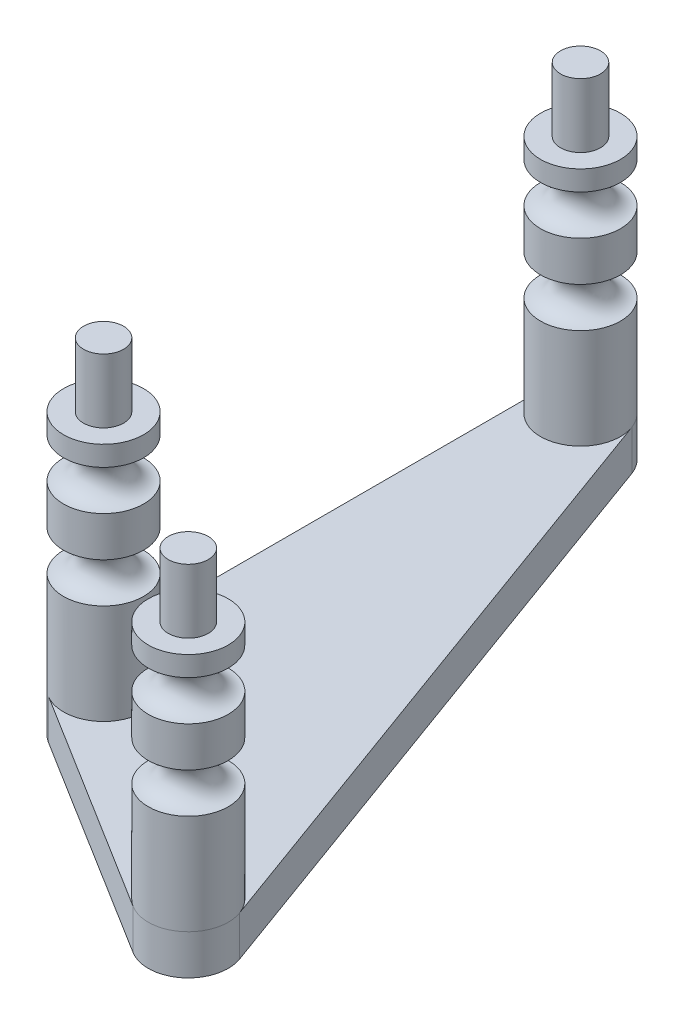
ISO-10303-21;
HEADER;
FILE_DESCRIPTION(('STEP AP214'),'2;1');
FILE_NAME('part.step','',(''),(''),'','','');
FILE_SCHEMA(('AUTOMOTIVE_DESIGN { 1 0 10303 214 1 1 1 1 }'));
ENDSEC;
DATA;
#1=APPLICATION_CONTEXT('core data for automotive mechanical design processes');
#2=APPLICATION_PROTOCOL_DEFINITION('international standard','automotive_design',2000,#1);
#3=PRODUCT_CONTEXT('',#1,'mechanical');
#4=PRODUCT('Part','Part','',(#3));
#5=PRODUCT_RELATED_PRODUCT_CATEGORY('part','',(#4));
#6=PRODUCT_DEFINITION_FORMATION('','',#4);
#7=PRODUCT_DEFINITION_CONTEXT('part definition',#1,'design');
#8=PRODUCT_DEFINITION('design','',#6,#7);
#9=PRODUCT_DEFINITION_SHAPE('','',#8);
#10=(LENGTH_UNIT() NAMED_UNIT(*) SI_UNIT(.MILLI.,.METRE.));
#11=(NAMED_UNIT(*) PLANE_ANGLE_UNIT() SI_UNIT($,.RADIAN.));
#12=(NAMED_UNIT(*) SI_UNIT($,.STERADIAN.) SOLID_ANGLE_UNIT());
#13=UNCERTAINTY_MEASURE_WITH_UNIT(LENGTH_MEASURE(1.E-05),#10,'distance_accuracy_value','');
#14=(GEOMETRIC_REPRESENTATION_CONTEXT(3) GLOBAL_UNCERTAINTY_ASSIGNED_CONTEXT((#13)) GLOBAL_UNIT_ASSIGNED_CONTEXT((#10,
#11,#12)) REPRESENTATION_CONTEXT('',''));
#15=CARTESIAN_POINT('',(0.,0.,0.));
#16=DIRECTION('',(0.,0.,1.));
#17=DIRECTION('',(1.,0.,0.));
#18=AXIS2_PLACEMENT_3D('',#15,#16,#17);
#19=CARTESIAN_POINT('',(0.,44.45,-75.68438));
#20=DIRECTION('',(0.,-1.,0.));
#21=DIRECTION('',(0.,0.,-1.));
#22=AXIS2_PLACEMENT_3D('',#19,#20,#21);
#23=CYLINDRICAL_SURFACE('',#22,6.35);
#24=CARTESIAN_POINT('',(0.,6.35,-75.68438));
#25=DIRECTION('',(0.,1.,0.));
#26=DIRECTION('',(0.,0.,1.));
#27=AXIS2_PLACEMENT_3D('',#24,#25,#26);
#28=CIRCLE('',#27,6.35);
#29=CARTESIAN_POINT('',(-6.35,6.35,-75.68438));
#30=VERTEX_POINT('',#29);
#31=CARTESIAN_POINT('',(5.96704814199053,6.35,-77.856207910118));
#32=VERTEX_POINT('',#31);
#33=EDGE_CURVE('E343',#30,#32,#28,.F.);
#34=ORIENTED_EDGE('',*,*,#33,.F.);
#35=EDGE_CURVE('E346',#32,#30,#28,.F.);
#36=ORIENTED_EDGE('',*,*,#35,.F.);
#37=EDGE_LOOP('',(#34,#36));
#38=FACE_BOUND('',#37,.T.);
#39=CARTESIAN_POINT('',(0.,22.225,-75.68438));
#40=DIRECTION('',(0.,1.,0.));
#41=DIRECTION('',(0.,0.,1.));
#42=AXIS2_PLACEMENT_3D('',#39,#40,#41);
#43=CIRCLE('',#42,6.35);
#44=CARTESIAN_POINT('',(0.,22.225,-69.33438));
#45=VERTEX_POINT('',#44);
#46=EDGE_CURVE('E301',#45,#45,#43,.T.);
#47=ORIENTED_EDGE('',*,*,#46,.F.);
#48=EDGE_LOOP('',(#47));
#49=FACE_BOUND('',#48,.T.);
#50=ADVANCED_FACE('F179',(#38,#49),#23,.T.);
#51=CARTESIAN_POINT('',(0.,6.35,0.));
#52=DIRECTION('',(0.,-1.,0.));
#53=DIRECTION('',(0.,0.,-1.));
#54=AXIS2_PLACEMENT_3D('',#51,#52,#53);
#55=CYLINDRICAL_SURFACE('',#54,6.35);
#56=DIRECTION('',(0.,-1.,0.));
#57=VECTOR('',#56,1.);
#58=CARTESIAN_POINT('',(-3.35600824597808,6.35,5.39070576575342));
#59=LINE('',#58,#57);
#60=CARTESIAN_POINT('',(-3.35600824597808,6.35,5.39070576575342));
#61=VERTEX_POINT('',#60);
#62=CARTESIAN_POINT('',(-3.35600824597808,0.,5.39070576575342));
#63=VERTEX_POINT('',#62);
#64=EDGE_CURVE('E477',#61,#63,#59,.T.);
#65=ORIENTED_EDGE('',*,*,#64,.F.);
#66=CARTESIAN_POINT('',(0.,6.35,0.));
#67=DIRECTION('',(0.,1.,0.));
#68=DIRECTION('',(0.,0.,1.));
#69=AXIS2_PLACEMENT_3D('',#66,#67,#68);
#70=CIRCLE('',#69,6.35);
#71=CARTESIAN_POINT('',(-6.35,6.35,0.));
#72=VERTEX_POINT('',#71);
#73=EDGE_CURVE('E468',#72,#61,#70,.F.);
#74=ORIENTED_EDGE('',*,*,#73,.F.);
#75=DIRECTION('',(0.,-1.,0.));
#76=VECTOR('',#75,1.);
#77=CARTESIAN_POINT('',(-6.35,6.35,0.));
#78=LINE('',#77,#76);
#79=CARTESIAN_POINT('',(-6.35,0.,0.));
#80=VERTEX_POINT('',#79);
#81=EDGE_CURVE('E358',#72,#80,#78,.T.);
#82=ORIENTED_EDGE('',*,*,#81,.T.);
#83=CARTESIAN_POINT('',(0.,0.,0.));
#84=DIRECTION('',(0.,1.,0.));
#85=DIRECTION('',(0.,0.,1.));
#86=AXIS2_PLACEMENT_3D('',#83,#84,#85);
#87=CIRCLE('',#86,6.35);
#88=EDGE_CURVE('E347',#80,#63,#87,.T.);
#89=ORIENTED_EDGE('',*,*,#88,.T.);
#90=EDGE_LOOP('',(#65,#74,#82,#89));
#91=FACE_BOUND('',#90,.T.);
#92=CARTESIAN_POINT('',(0.,22.225,0.));
#93=DIRECTION('',(0.,1.,0.));
#94=DIRECTION('',(0.,0.,1.));
#95=AXIS2_PLACEMENT_3D('',#92,#93,#94);
#96=CIRCLE('',#95,6.35);
#97=CARTESIAN_POINT('',(0.,22.225,6.35));
#98=VERTEX_POINT('',#97);
#99=EDGE_CURVE('E287',#98,#98,#96,.T.);
#100=ORIENTED_EDGE('',*,*,#99,.F.);
#101=EDGE_LOOP('',(#100));
#102=FACE_BOUND('',#101,.T.);
#103=ADVANCED_FACE('F334',(#91,#102),#55,.T.);
#104=CARTESIAN_POINT('',(35.617471135486,44.45,22.1738176828264));
#105=DIRECTION('',(0.,-1.,0.));
#106=DIRECTION('',(0.,0.,-1.));
#107=AXIS2_PLACEMENT_3D('',#104,#105,#106);
#108=CYLINDRICAL_SURFACE('',#107,6.35);
#109=CARTESIAN_POINT('',(35.617471135486,6.35,22.1738176828264));
#110=DIRECTION('',(0.,1.,0.));
#111=DIRECTION('',(0.,0.,1.));
#112=AXIS2_PLACEMENT_3D('',#109,#110,#111);
#113=CIRCLE('',#112,6.35);
#114=CARTESIAN_POINT('',(32.2614628895079,6.35,27.5645234485798));
#115=VERTEX_POINT('',#114);
#116=CARTESIAN_POINT('',(41.5845192774765,6.35,20.0019897727084));
#117=VERTEX_POINT('',#116);
#118=EDGE_CURVE('E239',#115,#117,#113,.F.);
#119=ORIENTED_EDGE('',*,*,#118,.F.);
#120=EDGE_CURVE('E235',#117,#115,#113,.F.);
#121=ORIENTED_EDGE('',*,*,#120,.F.);
#122=EDGE_LOOP('',(#119,#121));
#123=FACE_BOUND('',#122,.T.);
#124=CARTESIAN_POINT('',(35.617471135486,22.225,22.1738176828264));
#125=DIRECTION('',(0.,1.,0.));
#126=DIRECTION('',(0.,0.,1.));
#127=AXIS2_PLACEMENT_3D('',#124,#125,#126);
#128=CIRCLE('',#127,6.35);
#129=CARTESIAN_POINT('',(35.617471135486,22.225,28.5238176828264));
#130=VERTEX_POINT('',#129);
#131=EDGE_CURVE('E276',#130,#130,#128,.T.);
#132=ORIENTED_EDGE('',*,*,#131,.F.);
#133=EDGE_LOOP('',(#132));
#134=FACE_BOUND('',#133,.T.);
#135=ADVANCED_FACE('F237',(#123,#134),#108,.T.);
#136=CARTESIAN_POINT('',(0.,6.35,0.));
#137=DIRECTION('',(0.,1.,0.));
#138=DIRECTION('',(0.,0.,1.));
#139=AXIS2_PLACEMENT_3D('',#136,#137,#138);
#140=PLANE('',#139);
#141=DIRECTION('',(-0.848930041850932,0.,-0.528505235587099));
#142=VECTOR('',#141,1.);
#143=CARTESIAN_POINT('',(-3.35600824597808,6.35,5.39070576575342));
#144=LINE('',#143,#142);
#145=EDGE_CURVE('E253',#115,#61,#144,.T.);
#146=ORIENTED_EDGE('',*,*,#145,.F.);
#147=ORIENTED_EDGE('',*,*,#118,.T.);
#148=DIRECTION('',(0.342020143325663,0.,0.939692620785911));
#149=VECTOR('',#148,1.);
#150=CARTESIAN_POINT('',(30.291538997394,6.35,-11.0252185451651));
#151=LINE('',#150,#149);
#152=EDGE_CURVE('E244',#32,#117,#151,.T.);
#153=ORIENTED_EDGE('',*,*,#152,.F.);
#154=ORIENTED_EDGE('',*,*,#35,.T.);
#155=DIRECTION('',(0.,0.,-1.));
#156=VECTOR('',#155,1.);
#157=CARTESIAN_POINT('',(-6.35,6.35,0.));
#158=LINE('',#157,#156);
#159=EDGE_CURVE('E351',#72,#30,#158,.T.);
#160=ORIENTED_EDGE('',*,*,#159,.F.);
#161=ORIENTED_EDGE('',*,*,#73,.T.);
#162=EDGE_LOOP('',(#146,#147,#153,#154,#160,#161));
#163=FACE_BOUND('',#162,.T.);
#164=ADVANCED_FACE('F249',(#163),#140,.T.);
#165=CARTESIAN_POINT('',(-3.35600824597808,6.35,5.39070576575342));
#166=DIRECTION('',(-0.528505235587099,0.,0.848930041850932));
#167=DIRECTION('',(0.848930041850932,0.,0.528505235587099));
#168=AXIS2_PLACEMENT_3D('',#165,#166,#167);
#169=PLANE('',#168);
#170=DIRECTION('',(-0.848930041850932,0.,-0.528505235587099));
#171=VECTOR('',#170,1.);
#172=CARTESIAN_POINT('',(-3.35600824597808,0.,5.39070576575342));
#173=LINE('',#172,#171);
#174=CARTESIAN_POINT('',(32.2614628895079,0.,27.5645234485798));
#175=VERTEX_POINT('',#174);
#176=EDGE_CURVE('E359',#175,#63,#173,.T.);
#177=ORIENTED_EDGE('',*,*,#176,.F.);
#178=DIRECTION('',(0.,-1.,0.));
#179=VECTOR('',#178,1.);
#180=CARTESIAN_POINT('',(32.2614628895079,6.35,27.5645234485798));
#181=LINE('',#180,#179);
#182=EDGE_CURVE('E268',#175,#115,#181,.F.);
#183=ORIENTED_EDGE('',*,*,#182,.T.);
#184=ORIENTED_EDGE('',*,*,#145,.T.);
#185=ORIENTED_EDGE('',*,*,#64,.T.);
#186=EDGE_LOOP('',(#177,#183,#184,#185));
#187=FACE_BOUND('',#186,.T.);
#188=ADVANCED_FACE('F380',(#187),#169,.T.);
#189=CARTESIAN_POINT('',(30.291538997394,6.35,-11.0252185451651));
#190=DIRECTION('',(0.93969262078591,0.,-0.342020143325663));
#191=DIRECTION('',(-0.342020143325663,0.,-0.939692620785911));
#192=AXIS2_PLACEMENT_3D('',#189,#190,#191);
#193=PLANE('',#192);
#194=ORIENTED_EDGE('',*,*,#152,.T.);
#195=DIRECTION('',(0.,-1.,0.));
#196=VECTOR('',#195,1.);
#197=CARTESIAN_POINT('',(41.5845192774765,6.35,20.0019897727084));
#198=LINE('',#197,#196);
#199=CARTESIAN_POINT('',(41.5845192774765,0.,20.0019897727084));
#200=VERTEX_POINT('',#199);
#201=EDGE_CURVE('E259',#117,#200,#198,.T.);
#202=ORIENTED_EDGE('',*,*,#201,.T.);
#203=DIRECTION('',(0.342020143325663,0.,0.939692620785911));
#204=VECTOR('',#203,1.);
#205=CARTESIAN_POINT('',(30.291538997394,0.,-11.0252185451651));
#206=LINE('',#205,#204);
#207=CARTESIAN_POINT('',(5.96704814199053,0.,-77.856207910118));
#208=VERTEX_POINT('',#207);
#209=EDGE_CURVE('E472',#208,#200,#206,.T.);
#210=ORIENTED_EDGE('',*,*,#209,.F.);
#211=DIRECTION('',(0.,-1.,0.));
#212=VECTOR('',#211,1.);
#213=CARTESIAN_POINT('',(5.96704814199053,6.35,-77.856207910118));
#214=LINE('',#213,#212);
#215=EDGE_CURVE('E254',#208,#32,#214,.F.);
#216=ORIENTED_EDGE('',*,*,#215,.T.);
#217=EDGE_LOOP('',(#194,#202,#210,#216));
#218=FACE_BOUND('',#217,.T.);
#219=ADVANCED_FACE('F257',(#218),#193,.T.);
#220=CARTESIAN_POINT('',(0.,0.,0.));
#221=DIRECTION('',(0.,1.,0.));
#222=DIRECTION('',(0.,0.,1.));
#223=AXIS2_PLACEMENT_3D('',#220,#221,#222);
#224=PLANE('',#223);
#225=ORIENTED_EDGE('',*,*,#209,.T.);
#226=CARTESIAN_POINT('',(35.617471135486,0.,22.1738176828264));
#227=DIRECTION('',(0.,1.,0.));
#228=DIRECTION('',(0.,0.,1.));
#229=AXIS2_PLACEMENT_3D('',#226,#227,#228);
#230=CIRCLE('',#229,6.35);
#231=EDGE_CURVE('E204',#200,#175,#230,.F.);
#232=ORIENTED_EDGE('',*,*,#231,.T.);
#233=ORIENTED_EDGE('',*,*,#176,.T.);
#234=ORIENTED_EDGE('',*,*,#88,.F.);
#235=DIRECTION('',(0.,0.,-1.));
#236=VECTOR('',#235,1.);
#237=CARTESIAN_POINT('',(-6.35,0.,0.));
#238=LINE('',#237,#236);
#239=CARTESIAN_POINT('',(-6.35,0.,-75.68438));
#240=VERTEX_POINT('',#239);
#241=EDGE_CURVE('E360',#80,#240,#238,.T.);
#242=ORIENTED_EDGE('',*,*,#241,.T.);
#243=CARTESIAN_POINT('',(0.,0.,-75.68438));
#244=DIRECTION('',(0.,1.,0.));
#245=DIRECTION('',(0.,0.,1.));
#246=AXIS2_PLACEMENT_3D('',#243,#244,#245);
#247=CIRCLE('',#246,6.35);
#248=EDGE_CURVE('E196',#240,#208,#247,.F.);
#249=ORIENTED_EDGE('',*,*,#248,.T.);
#250=EDGE_LOOP('',(#225,#232,#233,#234,#242,#249));
#251=FACE_BOUND('',#250,.T.);
#252=ADVANCED_FACE('F374',(#251),#224,.F.);
#253=CARTESIAN_POINT('',(-6.35,6.35,0.));
#254=DIRECTION('',(-1.,0.,0.));
#255=DIRECTION('',(0.,0.,1.));
#256=AXIS2_PLACEMENT_3D('',#253,#254,#255);
#257=PLANE('',#256);
#258=ORIENTED_EDGE('',*,*,#159,.T.);
#259=DIRECTION('',(0.,-1.,0.));
#260=VECTOR('',#259,1.);
#261=CARTESIAN_POINT('',(-6.35,6.35,-75.68438));
#262=LINE('',#261,#260);
#263=EDGE_CURVE('E270',#30,#240,#262,.T.);
#264=ORIENTED_EDGE('',*,*,#263,.T.);
#265=ORIENTED_EDGE('',*,*,#241,.F.);
#266=ORIENTED_EDGE('',*,*,#81,.F.);
#267=EDGE_LOOP('',(#258,#264,#265,#266));
#268=FACE_BOUND('',#267,.T.);
#269=ADVANCED_FACE('F355',(#268),#257,.T.);
#270=CARTESIAN_POINT('',(35.617471135486,6.35,22.1738176828264));
#271=DIRECTION('',(0.,-1.,0.));
#272=DIRECTION('',(0.,0.,-1.));
#273=AXIS2_PLACEMENT_3D('',#270,#271,#272);
#274=CYLINDRICAL_SURFACE('',#273,6.35);
#275=ORIENTED_EDGE('',*,*,#120,.T.);
#276=ORIENTED_EDGE('',*,*,#182,.F.);
#277=ORIENTED_EDGE('',*,*,#231,.F.);
#278=ORIENTED_EDGE('',*,*,#201,.F.);
#279=EDGE_LOOP('',(#275,#276,#277,#278));
#280=FACE_BOUND('',#279,.T.);
#281=ADVANCED_FACE('F262',(#280),#274,.T.);
#282=CARTESIAN_POINT('',(0.,6.35,-75.68438));
#283=DIRECTION('',(0.,-1.,0.));
#284=DIRECTION('',(0.,0.,-1.));
#285=AXIS2_PLACEMENT_3D('',#282,#283,#284);
#286=CYLINDRICAL_SURFACE('',#285,6.35);
#287=ORIENTED_EDGE('',*,*,#33,.T.);
#288=ORIENTED_EDGE('',*,*,#215,.F.);
#289=ORIENTED_EDGE('',*,*,#248,.F.);
#290=ORIENTED_EDGE('',*,*,#263,.F.);
#291=EDGE_LOOP('',(#287,#288,#289,#290));
#292=FACE_BOUND('',#291,.T.);
#293=ADVANCED_FACE('F181',(#292),#286,.T.);
#294=CARTESIAN_POINT('',(35.617471135486,25.4,22.1738176828264));
#295=DIRECTION('',(0.,-1.,0.));
#296=DIRECTION('',(0.,0.,-1.));
#297=AXIS2_PLACEMENT_3D('',#294,#295,#296);
#298=TOROIDAL_SURFACE('',#297,6.35,3.175);
#299=CARTESIAN_POINT('',(35.617471135486,28.575,22.1738176828264));
#300=DIRECTION('',(0.,-1.,0.));
#301=DIRECTION('',(0.,0.,-1.));
#302=AXIS2_PLACEMENT_3D('',#299,#300,#301);
#303=CIRCLE('',#302,6.35);
#304=CARTESIAN_POINT('',(35.617471135486,28.575,15.8238176828264));
#305=VERTEX_POINT('',#304);
#306=EDGE_CURVE('E273',#305,#305,#303,.T.);
#307=ORIENTED_EDGE('',*,*,#306,.T.);
#308=EDGE_LOOP('',(#307));
#309=FACE_BOUND('',#308,.T.);
#310=ORIENTED_EDGE('',*,*,#131,.T.);
#311=EDGE_LOOP('',(#310));
#312=FACE_BOUND('',#311,.T.);
#313=ADVANCED_FACE('F363',(#309,#312),#298,.F.);
#314=ORIENTED_EDGE('',*,*,#306,.F.);
#315=EDGE_LOOP('',(#314));
#316=FACE_BOUND('',#315,.T.);
#317=CARTESIAN_POINT('',(35.617471135486,34.925,22.1738176828264));
#318=DIRECTION('',(0.,1.,0.));
#319=DIRECTION('',(0.,0.,1.));
#320=AXIS2_PLACEMENT_3D('',#317,#318,#319);
#321=CIRCLE('',#320,6.35);
#322=CARTESIAN_POINT('',(35.617471135486,34.925,28.5238176828264));
#323=VERTEX_POINT('',#322);
#324=EDGE_CURVE('E283',#323,#323,#321,.T.);
#325=ORIENTED_EDGE('',*,*,#324,.F.);
#326=EDGE_LOOP('',(#325));
#327=FACE_BOUND('',#326,.T.);
#328=ADVANCED_FACE('F368',(#316,#327),#108,.T.);
#329=CARTESIAN_POINT('',(35.617471135486,38.1,22.1738176828264));
#330=DIRECTION('',(0.,-1.,0.));
#331=DIRECTION('',(0.,0.,-1.));
#332=AXIS2_PLACEMENT_3D('',#329,#330,#331);
#333=TOROIDAL_SURFACE('',#332,6.35,3.175);
#334=CARTESIAN_POINT('',(35.617471135486,41.275,22.1738176828264));
#335=DIRECTION('',(0.,-1.,0.));
#336=DIRECTION('',(0.,0.,-1.));
#337=AXIS2_PLACEMENT_3D('',#334,#335,#336);
#338=CIRCLE('',#337,6.35);
#339=CARTESIAN_POINT('',(35.617471135486,41.275,15.8238176828264));
#340=VERTEX_POINT('',#339);
#341=EDGE_CURVE('E280',#340,#340,#338,.T.);
#342=ORIENTED_EDGE('',*,*,#341,.T.);
#343=EDGE_LOOP('',(#342));
#344=FACE_BOUND('',#343,.T.);
#345=ORIENTED_EDGE('',*,*,#324,.T.);
#346=EDGE_LOOP('',(#345));
#347=FACE_BOUND('',#346,.T.);
#348=ADVANCED_FACE('F398',(#344,#347),#333,.F.);
#349=CARTESIAN_POINT('',(35.617471135486,54.61,22.1738176828264));
#350=DIRECTION('',(0.,1.,0.));
#351=DIRECTION('',(0.,0.,1.));
#352=AXIS2_PLACEMENT_3D('',#349,#350,#351);
#353=PLANE('',#352);
#354=CARTESIAN_POINT('',(35.617471135486,54.61,22.1738176828264));
#355=DIRECTION('',(0.,1.,0.));
#356=DIRECTION('',(0.,0.,1.));
#357=AXIS2_PLACEMENT_3D('',#354,#355,#356);
#358=CIRCLE('',#357,3.175);
#359=CARTESIAN_POINT('',(35.617471135486,54.61,25.3488176828264));
#360=VERTEX_POINT('',#359);
#361=EDGE_CURVE('E696',#360,#360,#358,.T.);
#362=ORIENTED_EDGE('',*,*,#361,.T.);
#363=EDGE_LOOP('',(#362));
#364=FACE_BOUND('',#363,.T.);
#365=ADVANCED_FACE('F420',(#364),#353,.T.);
#366=CARTESIAN_POINT('',(35.617471135486,54.61,22.1738176828264));
#367=DIRECTION('',(0.,-1.,0.));
#368=DIRECTION('',(0.,0.,-1.));
#369=AXIS2_PLACEMENT_3D('',#366,#367,#368);
#370=CYLINDRICAL_SURFACE('',#369,3.175);
#371=ORIENTED_EDGE('',*,*,#361,.F.);
#372=EDGE_LOOP('',(#371));
#373=FACE_BOUND('',#372,.T.);
#374=CARTESIAN_POINT('',(35.617471135486,44.45,22.1738176828264));
#375=DIRECTION('',(0.,1.,0.));
#376=DIRECTION('',(0.,0.,1.));
#377=AXIS2_PLACEMENT_3D('',#374,#375,#376);
#378=CIRCLE('',#377,3.175);
#379=CARTESIAN_POINT('',(35.617471135486,44.45,25.3488176828264));
#380=VERTEX_POINT('',#379);
#381=EDGE_CURVE('E188',#380,#380,#378,.T.);
#382=ORIENTED_EDGE('',*,*,#381,.T.);
#383=EDGE_LOOP('',(#382));
#384=FACE_BOUND('',#383,.T.);
#385=ADVANCED_FACE('F410',(#373,#384),#370,.T.);
#386=CARTESIAN_POINT('',(35.617471135486,44.45,22.1738176828264));
#387=DIRECTION('',(0.,1.,0.));
#388=DIRECTION('',(0.,0.,1.));
#389=AXIS2_PLACEMENT_3D('',#386,#387,#388);
#390=PLANE('',#389);
#391=ORIENTED_EDGE('',*,*,#381,.F.);
#392=EDGE_LOOP('',(#391));
#393=FACE_BOUND('',#392,.T.);
#394=CARTESIAN_POINT('',(35.617471135486,44.45,22.1738176828264));
#395=DIRECTION('',(0.,1.,0.));
#396=DIRECTION('',(0.,0.,1.));
#397=AXIS2_PLACEMENT_3D('',#394,#395,#396);
#398=CIRCLE('',#397,6.35);
#399=CARTESIAN_POINT('',(35.617471135486,44.45,28.5238176828264));
#400=VERTEX_POINT('',#399);
#401=EDGE_CURVE('E415',#400,#400,#398,.T.);
#402=ORIENTED_EDGE('',*,*,#401,.T.);
#403=EDGE_LOOP('',(#402));
#404=FACE_BOUND('',#403,.T.);
#405=ADVANCED_FACE('F402',(#393,#404),#390,.T.);
#406=ORIENTED_EDGE('',*,*,#401,.F.);
#407=EDGE_LOOP('',(#406));
#408=FACE_BOUND('',#407,.T.);
#409=ORIENTED_EDGE('',*,*,#341,.F.);
#410=EDGE_LOOP('',(#409));
#411=FACE_BOUND('',#410,.T.);
#412=ADVANCED_FACE('F392',(#408,#411),#108,.T.);
#413=CARTESIAN_POINT('',(0.,25.4,0.));
#414=DIRECTION('',(0.,1.,0.));
#415=DIRECTION('',(0.,0.,1.));
#416=AXIS2_PLACEMENT_3D('',#413,#414,#415);
#417=TOROIDAL_SURFACE('',#416,6.35,3.175);
#418=ORIENTED_EDGE('',*,*,#99,.T.);
#419=EDGE_LOOP('',(#418));
#420=FACE_BOUND('',#419,.T.);
#421=CARTESIAN_POINT('',(0.,28.575,0.));
#422=DIRECTION('',(0.,-1.,0.));
#423=DIRECTION('',(0.,0.,-1.));
#424=AXIS2_PLACEMENT_3D('',#421,#422,#423);
#425=CIRCLE('',#424,6.35);
#426=CARTESIAN_POINT('',(0.,28.575,-6.35));
#427=VERTEX_POINT('',#426);
#428=EDGE_CURVE('E290',#427,#427,#425,.T.);
#429=ORIENTED_EDGE('',*,*,#428,.T.);
#430=EDGE_LOOP('',(#429));
#431=FACE_BOUND('',#430,.T.);
#432=ADVANCED_FACE('F401',(#420,#431),#417,.F.);
#433=ORIENTED_EDGE('',*,*,#428,.F.);
#434=EDGE_LOOP('',(#433));
#435=FACE_BOUND('',#434,.T.);
#436=CARTESIAN_POINT('',(0.,34.925,0.));
#437=DIRECTION('',(0.,1.,0.));
#438=DIRECTION('',(0.,0.,1.));
#439=AXIS2_PLACEMENT_3D('',#436,#437,#438);
#440=CIRCLE('',#439,6.35);
#441=CARTESIAN_POINT('',(0.,34.925,6.35));
#442=VERTEX_POINT('',#441);
#443=EDGE_CURVE('E293',#442,#442,#440,.T.);
#444=ORIENTED_EDGE('',*,*,#443,.F.);
#445=EDGE_LOOP('',(#444));
#446=FACE_BOUND('',#445,.T.);
#447=ADVANCED_FACE('F341',(#435,#446),#55,.T.);
#448=CARTESIAN_POINT('',(0.,38.1,0.));
#449=DIRECTION('',(0.,1.,0.));
#450=DIRECTION('',(0.,0.,1.));
#451=AXIS2_PLACEMENT_3D('',#448,#449,#450);
#452=TOROIDAL_SURFACE('',#451,6.35,3.175);
#453=ORIENTED_EDGE('',*,*,#443,.T.);
#454=EDGE_LOOP('',(#453));
#455=FACE_BOUND('',#454,.T.);
#456=CARTESIAN_POINT('',(0.,41.275,0.));
#457=DIRECTION('',(0.,-1.,0.));
#458=DIRECTION('',(0.,0.,-1.));
#459=AXIS2_PLACEMENT_3D('',#456,#457,#458);
#460=CIRCLE('',#459,6.35);
#461=CARTESIAN_POINT('',(0.,41.275,-6.35));
#462=VERTEX_POINT('',#461);
#463=EDGE_CURVE('E277',#462,#462,#460,.T.);
#464=ORIENTED_EDGE('',*,*,#463,.T.);
#465=EDGE_LOOP('',(#464));
#466=FACE_BOUND('',#465,.T.);
#467=ADVANCED_FACE('F444',(#455,#466),#452,.F.);
#468=CARTESIAN_POINT('',(0.,54.61,0.));
#469=DIRECTION('',(0.,1.,0.));
#470=DIRECTION('',(0.,0.,1.));
#471=AXIS2_PLACEMENT_3D('',#468,#469,#470);
#472=PLANE('',#471);
#473=CARTESIAN_POINT('',(0.,54.61,0.));
#474=DIRECTION('',(0.,1.,0.));
#475=DIRECTION('',(0.,0.,1.));
#476=AXIS2_PLACEMENT_3D('',#473,#474,#475);
#477=CIRCLE('',#476,3.175);
#478=CARTESIAN_POINT('',(0.,54.61,3.175));
#479=VERTEX_POINT('',#478);
#480=EDGE_CURVE('E456',#479,#479,#477,.T.);
#481=ORIENTED_EDGE('',*,*,#480,.T.);
#482=EDGE_LOOP('',(#481));
#483=FACE_BOUND('',#482,.T.);
#484=ADVANCED_FACE('F441',(#483),#472,.T.);
#485=CARTESIAN_POINT('',(0.,54.61,0.));
#486=DIRECTION('',(0.,-1.,0.));
#487=DIRECTION('',(0.,0.,-1.));
#488=AXIS2_PLACEMENT_3D('',#485,#486,#487);
#489=CYLINDRICAL_SURFACE('',#488,3.175);
#490=ORIENTED_EDGE('',*,*,#480,.F.);
#491=EDGE_LOOP('',(#490));
#492=FACE_BOUND('',#491,.T.);
#493=CARTESIAN_POINT('',(0.,44.45,0.));
#494=DIRECTION('',(0.,1.,0.));
#495=DIRECTION('',(0.,0.,1.));
#496=AXIS2_PLACEMENT_3D('',#493,#494,#495);
#497=CIRCLE('',#496,3.175);
#498=CARTESIAN_POINT('',(0.,44.45,3.175));
#499=VERTEX_POINT('',#498);
#500=EDGE_CURVE('E272',#499,#499,#497,.T.);
#501=ORIENTED_EDGE('',*,*,#500,.T.);
#502=EDGE_LOOP('',(#501));
#503=FACE_BOUND('',#502,.T.);
#504=ADVANCED_FACE('F443',(#492,#503),#489,.T.);
#505=CARTESIAN_POINT('',(0.,44.45,0.));
#506=DIRECTION('',(0.,1.,0.));
#507=DIRECTION('',(0.,0.,1.));
#508=AXIS2_PLACEMENT_3D('',#505,#506,#507);
#509=PLANE('',#508);
#510=ORIENTED_EDGE('',*,*,#500,.F.);
#511=EDGE_LOOP('',(#510));
#512=FACE_BOUND('',#511,.T.);
#513=CARTESIAN_POINT('',(0.,44.45,0.));
#514=DIRECTION('',(0.,1.,0.));
#515=DIRECTION('',(0.,0.,1.));
#516=AXIS2_PLACEMENT_3D('',#513,#514,#515);
#517=CIRCLE('',#516,6.35);
#518=CARTESIAN_POINT('',(0.,44.45,6.35));
#519=VERTEX_POINT('',#518);
#520=EDGE_CURVE('E465',#519,#519,#517,.T.);
#521=ORIENTED_EDGE('',*,*,#520,.T.);
#522=EDGE_LOOP('',(#521));
#523=FACE_BOUND('',#522,.T.);
#524=ADVANCED_FACE('F377',(#512,#523),#509,.T.);
#525=ORIENTED_EDGE('',*,*,#520,.F.);
#526=EDGE_LOOP('',(#525));
#527=FACE_BOUND('',#526,.T.);
#528=ORIENTED_EDGE('',*,*,#463,.F.);
#529=EDGE_LOOP('',(#528));
#530=FACE_BOUND('',#529,.T.);
#531=ADVANCED_FACE('F324',(#527,#530),#55,.T.);
#532=CARTESIAN_POINT('',(0.,25.4,-75.68438));
#533=DIRECTION('',(0.,-1.,0.));
#534=DIRECTION('',(0.,0.,-1.));
#535=AXIS2_PLACEMENT_3D('',#532,#533,#534);
#536=TOROIDAL_SURFACE('',#535,6.35,3.175);
#537=CARTESIAN_POINT('',(0.,28.575,-75.68438));
#538=DIRECTION('',(0.,-1.,0.));
#539=DIRECTION('',(0.,0.,-1.));
#540=AXIS2_PLACEMENT_3D('',#537,#538,#539);
#541=CIRCLE('',#540,6.35);
#542=CARTESIAN_POINT('',(0.,28.575,-82.03438));
#543=VERTEX_POINT('',#542);
#544=EDGE_CURVE('E298',#543,#543,#541,.T.);
#545=ORIENTED_EDGE('',*,*,#544,.T.);
#546=EDGE_LOOP('',(#545));
#547=FACE_BOUND('',#546,.T.);
#548=ORIENTED_EDGE('',*,*,#46,.T.);
#549=EDGE_LOOP('',(#548));
#550=FACE_BOUND('',#549,.T.);
#551=ADVANCED_FACE('F314',(#547,#550),#536,.F.);
#552=ORIENTED_EDGE('',*,*,#544,.F.);
#553=EDGE_LOOP('',(#552));
#554=FACE_BOUND('',#553,.T.);
#555=CARTESIAN_POINT('',(0.,34.925,-75.68438));
#556=DIRECTION('',(0.,1.,0.));
#557=DIRECTION('',(0.,0.,1.));
#558=AXIS2_PLACEMENT_3D('',#555,#556,#557);
#559=CIRCLE('',#558,6.35);
#560=CARTESIAN_POINT('',(0.,34.925,-69.33438));
#561=VERTEX_POINT('',#560);
#562=EDGE_CURVE('E183',#561,#561,#559,.T.);
#563=ORIENTED_EDGE('',*,*,#562,.F.);
#564=EDGE_LOOP('',(#563));
#565=FACE_BOUND('',#564,.T.);
#566=ADVANCED_FACE('F312',(#554,#565),#23,.T.);
#567=CARTESIAN_POINT('',(0.,38.1,-75.68438));
#568=DIRECTION('',(0.,-1.,0.));
#569=DIRECTION('',(0.,0.,-1.));
#570=AXIS2_PLACEMENT_3D('',#567,#568,#569);
#571=TOROIDAL_SURFACE('',#570,6.35,3.175);
#572=CARTESIAN_POINT('',(0.,41.275,-75.68438));
#573=DIRECTION('',(0.,-1.,0.));
#574=DIRECTION('',(0.,0.,-1.));
#575=AXIS2_PLACEMENT_3D('',#572,#573,#574);
#576=CIRCLE('',#575,6.35);
#577=CARTESIAN_POINT('',(0.,41.275,-82.03438));
#578=VERTEX_POINT('',#577);
#579=EDGE_CURVE('E303',#578,#578,#576,.T.);
#580=ORIENTED_EDGE('',*,*,#579,.T.);
#581=EDGE_LOOP('',(#580));
#582=FACE_BOUND('',#581,.T.);
#583=ORIENTED_EDGE('',*,*,#562,.T.);
#584=EDGE_LOOP('',(#583));
#585=FACE_BOUND('',#584,.T.);
#586=ADVANCED_FACE('F310',(#582,#585),#571,.F.);
#587=CARTESIAN_POINT('',(0.,54.61,-75.68438));
#588=DIRECTION('',(0.,1.,0.));
#589=DIRECTION('',(0.,0.,1.));
#590=AXIS2_PLACEMENT_3D('',#587,#588,#589);
#591=PLANE('',#590);
#592=CARTESIAN_POINT('',(0.,54.61,-75.68438));
#593=DIRECTION('',(0.,1.,0.));
#594=DIRECTION('',(0.,0.,1.));
#595=AXIS2_PLACEMENT_3D('',#592,#593,#594);
#596=CIRCLE('',#595,3.175);
#597=CARTESIAN_POINT('',(0.,54.61,-72.50938));
#598=VERTEX_POINT('',#597);
#599=EDGE_CURVE('E286',#598,#598,#596,.T.);
#600=ORIENTED_EDGE('',*,*,#599,.T.);
#601=EDGE_LOOP('',(#600));
#602=FACE_BOUND('',#601,.T.);
#603=ADVANCED_FACE('F322',(#602),#591,.T.);
#604=CARTESIAN_POINT('',(0.,54.61,-75.68438));
#605=DIRECTION('',(0.,-1.,0.));
#606=DIRECTION('',(0.,0.,-1.));
#607=AXIS2_PLACEMENT_3D('',#604,#605,#606);
#608=CYLINDRICAL_SURFACE('',#607,3.175);
#609=ORIENTED_EDGE('',*,*,#599,.F.);
#610=EDGE_LOOP('',(#609));
#611=FACE_BOUND('',#610,.T.);
#612=CARTESIAN_POINT('',(0.,44.45,-75.68438));
#613=DIRECTION('',(0.,1.,0.));
#614=DIRECTION('',(0.,0.,1.));
#615=AXIS2_PLACEMENT_3D('',#612,#613,#614);
#616=CIRCLE('',#615,3.175);
#617=CARTESIAN_POINT('',(0.,44.45,-72.50938));
#618=VERTEX_POINT('',#617);
#619=EDGE_CURVE('E12',#618,#618,#616,.T.);
#620=ORIENTED_EDGE('',*,*,#619,.T.);
#621=EDGE_LOOP('',(#620));
#622=FACE_BOUND('',#621,.T.);
#623=ADVANCED_FACE('F433',(#611,#622),#608,.T.);
#624=CARTESIAN_POINT('',(0.,44.45,-75.68438));
#625=DIRECTION('',(0.,1.,0.));
#626=DIRECTION('',(0.,0.,1.));
#627=AXIS2_PLACEMENT_3D('',#624,#625,#626);
#628=PLANE('',#627);
#629=ORIENTED_EDGE('',*,*,#619,.F.);
#630=EDGE_LOOP('',(#629));
#631=FACE_BOUND('',#630,.T.);
#632=CARTESIAN_POINT('',(0.,44.45,-75.68438));
#633=DIRECTION('',(0.,1.,0.));
#634=DIRECTION('',(0.,0.,1.));
#635=AXIS2_PLACEMENT_3D('',#632,#633,#634);
#636=CIRCLE('',#635,6.35);
#637=CARTESIAN_POINT('',(0.,44.45,-69.33438));
#638=VERTEX_POINT('',#637);
#639=EDGE_CURVE('E353',#638,#638,#636,.T.);
#640=ORIENTED_EDGE('',*,*,#639,.T.);
#641=EDGE_LOOP('',(#640));
#642=FACE_BOUND('',#641,.T.);
#643=ADVANCED_FACE('F331',(#631,#642),#628,.T.);
#644=ORIENTED_EDGE('',*,*,#639,.F.);
#645=EDGE_LOOP('',(#644));
#646=FACE_BOUND('',#645,.T.);
#647=ORIENTED_EDGE('',*,*,#579,.F.);
#648=EDGE_LOOP('',(#647));
#649=FACE_BOUND('',#648,.T.);
#650=ADVANCED_FACE('F317',(#646,#649),#23,.T.);
#651=CLOSED_SHELL('',(#50,#103,#135,#164,#188,#219,#252,#269,#281,#293,#313,#328,#348,#365,#385,
#405,#412,#432,#447,#467,#484,#504,#524,#531,#551,#566,#586,#603,#623,#643,#650));
#652=MANIFOLD_SOLID_BREP('B2',#651);
#653=ADVANCED_BREP_SHAPE_REPRESENTATION('',(#18,#652),#14);
#654=SHAPE_DEFINITION_REPRESENTATION(#9,#653);
ENDSEC;
END-ISO-10303-21;
